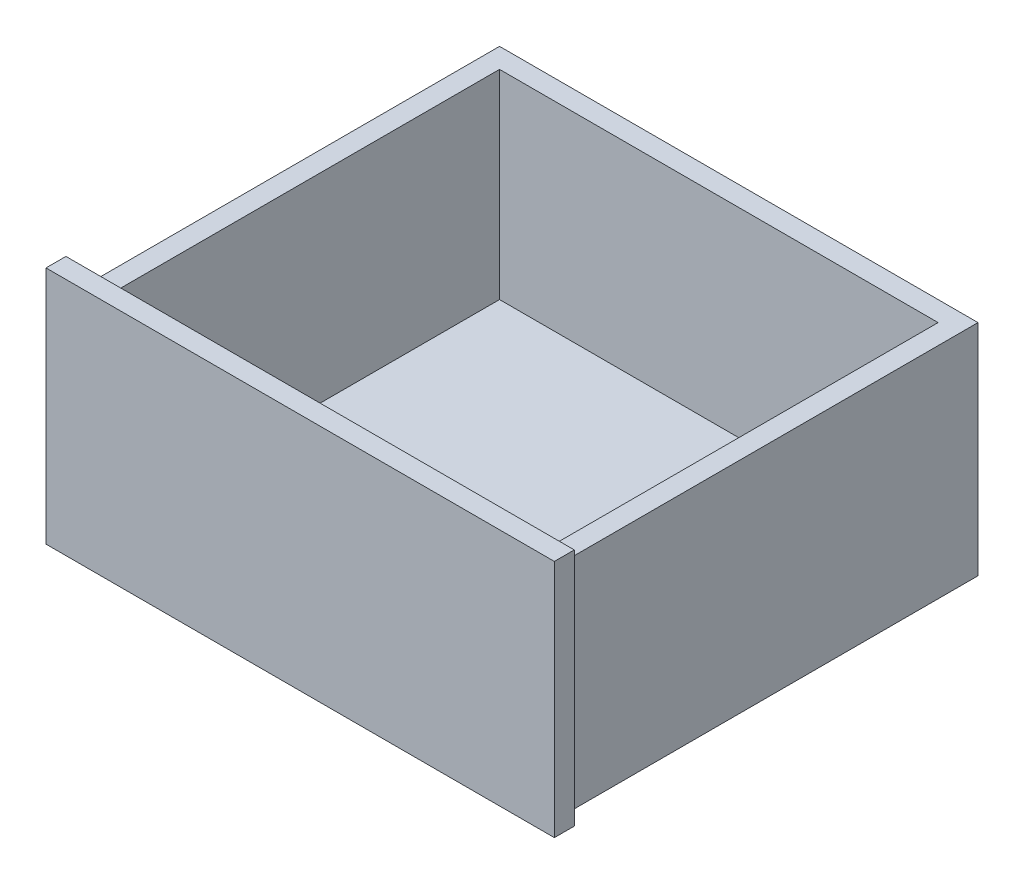
ISO-10303-21;
HEADER;
FILE_DESCRIPTION(('STEP AP214'),'2;1');
FILE_NAME('part.step','',(''),(''),'','','');
FILE_SCHEMA(('AUTOMOTIVE_DESIGN { 1 0 10303 214 1 1 1 1 }'));
ENDSEC;
DATA;
#1=APPLICATION_CONTEXT('core data for automotive mechanical design processes');
#2=APPLICATION_PROTOCOL_DEFINITION('international standard','automotive_design',2000,#1);
#3=PRODUCT_CONTEXT('',#1,'mechanical');
#4=PRODUCT('Part','Part','',(#3));
#5=PRODUCT_RELATED_PRODUCT_CATEGORY('part','',(#4));
#6=PRODUCT_DEFINITION_FORMATION('','',#4);
#7=PRODUCT_DEFINITION_CONTEXT('part definition',#1,'design');
#8=PRODUCT_DEFINITION('design','',#6,#7);
#9=PRODUCT_DEFINITION_SHAPE('','',#8);
#10=(LENGTH_UNIT() NAMED_UNIT(*) SI_UNIT(.MILLI.,.METRE.));
#11=(NAMED_UNIT(*) PLANE_ANGLE_UNIT() SI_UNIT($,.RADIAN.));
#12=(NAMED_UNIT(*) SI_UNIT($,.STERADIAN.) SOLID_ANGLE_UNIT());
#13=UNCERTAINTY_MEASURE_WITH_UNIT(LENGTH_MEASURE(1.E-05),#10,'distance_accuracy_value','');
#14=(GEOMETRIC_REPRESENTATION_CONTEXT(3) GLOBAL_UNCERTAINTY_ASSIGNED_CONTEXT((#13)) GLOBAL_UNIT_ASSIGNED_CONTEXT((#10,
#11,#12)) REPRESENTATION_CONTEXT('',''));
#15=CARTESIAN_POINT('',(0.,0.,0.));
#16=DIRECTION('',(0.,0.,1.));
#17=DIRECTION('',(1.,0.,0.));
#18=AXIS2_PLACEMENT_3D('',#15,#16,#17);
#19=CARTESIAN_POINT('',(0.,0.,0.));
#20=DIRECTION('',(0.,0.,-1.));
#21=DIRECTION('',(-1.,0.,0.));
#22=AXIS2_PLACEMENT_3D('',#19,#20,#21);
#23=PLANE('',#22);
#24=DIRECTION('',(0.,-1.,0.));
#25=VECTOR('',#24,1.);
#26=CARTESIAN_POINT('',(-30.48,96.241711093038,0.));
#27=LINE('',#26,#25);
#28=CARTESIAN_POINT('',(-30.48,12.7,0.));
#29=VERTEX_POINT('',#28);
#30=CARTESIAN_POINT('',(-30.48,-15.24,0.));
#31=VERTEX_POINT('',#30);
#32=EDGE_CURVE('E64',#29,#31,#27,.T.);
#33=ORIENTED_EDGE('',*,*,#32,.T.);
#34=DIRECTION('',(1.,0.,0.));
#35=VECTOR('',#34,1.);
#36=CARTESIAN_POINT('',(-32.385,-15.24,0.));
#37=LINE('',#36,#35);
#38=CARTESIAN_POINT('',(-32.385,-15.24,0.));
#39=VERTEX_POINT('',#38);
#40=EDGE_CURVE('E153',#39,#31,#37,.T.);
#41=ORIENTED_EDGE('',*,*,#40,.F.);
#42=DIRECTION('',(0.,-1.,0.));
#43=VECTOR('',#42,1.);
#44=CARTESIAN_POINT('',(-32.385,-15.24,0.));
#45=LINE('',#44,#43);
#46=CARTESIAN_POINT('',(-32.385,15.24,0.));
#47=VERTEX_POINT('',#46);
#48=EDGE_CURVE('E215',#47,#39,#45,.T.);
#49=ORIENTED_EDGE('',*,*,#48,.F.);
#50=DIRECTION('',(-1.,0.,0.));
#51=VECTOR('',#50,1.);
#52=CARTESIAN_POINT('',(-32.385,15.24,0.));
#53=LINE('',#52,#51);
#54=CARTESIAN_POINT('',(32.385,15.24,0.));
#55=VERTEX_POINT('',#54);
#56=EDGE_CURVE('E213',#55,#47,#53,.T.);
#57=ORIENTED_EDGE('',*,*,#56,.F.);
#58=DIRECTION('',(0.,1.,0.));
#59=VECTOR('',#58,1.);
#60=CARTESIAN_POINT('',(32.385,-15.24,0.));
#61=LINE('',#60,#59);
#62=CARTESIAN_POINT('',(32.385,-15.24,0.));
#63=VERTEX_POINT('',#62);
#64=EDGE_CURVE('E177',#63,#55,#61,.T.);
#65=ORIENTED_EDGE('',*,*,#64,.F.);
#66=CARTESIAN_POINT('',(30.48,-15.24,0.));
#67=VERTEX_POINT('',#66);
#68=EDGE_CURVE('E217',#67,#63,#37,.T.);
#69=ORIENTED_EDGE('',*,*,#68,.F.);
#70=DIRECTION('',(0.,-1.,0.));
#71=VECTOR('',#70,1.);
#72=CARTESIAN_POINT('',(30.48,96.241711093038,0.));
#73=LINE('',#72,#71);
#74=CARTESIAN_POINT('',(30.48,12.7,0.));
#75=VERTEX_POINT('',#74);
#76=EDGE_CURVE('E196',#75,#67,#73,.T.);
#77=ORIENTED_EDGE('',*,*,#76,.F.);
#78=DIRECTION('',(-1.,0.,0.));
#79=VECTOR('',#78,1.);
#80=CARTESIAN_POINT('',(0.,12.7,0.));
#81=LINE('',#80,#79);
#82=CARTESIAN_POINT('',(27.94,12.7,0.));
#83=VERTEX_POINT('',#82);
#84=EDGE_CURVE('E172',#75,#83,#81,.T.);
#85=ORIENTED_EDGE('',*,*,#84,.T.);
#86=DIRECTION('',(0.,-1.,0.));
#87=VECTOR('',#86,1.);
#88=CARTESIAN_POINT('',(27.94,96.241711093038,0.));
#89=LINE('',#88,#87);
#90=CARTESIAN_POINT('',(27.94,-12.7,0.));
#91=VERTEX_POINT('',#90);
#92=EDGE_CURVE('E56',#83,#91,#89,.T.);
#93=ORIENTED_EDGE('',*,*,#92,.T.);
#94=DIRECTION('',(-1.,0.,0.));
#95=VECTOR('',#94,1.);
#96=CARTESIAN_POINT('',(-30.48,-12.7,0.));
#97=LINE('',#96,#95);
#98=CARTESIAN_POINT('',(-27.94,-12.7,0.));
#99=VERTEX_POINT('',#98);
#100=EDGE_CURVE('E156',#91,#99,#97,.T.);
#101=ORIENTED_EDGE('',*,*,#100,.T.);
#102=DIRECTION('',(0.,-1.,0.));
#103=VECTOR('',#102,1.);
#104=CARTESIAN_POINT('',(-27.94,96.241711093038,0.));
#105=LINE('',#104,#103);
#106=CARTESIAN_POINT('',(-27.94,12.7,0.));
#107=VERTEX_POINT('',#106);
#108=EDGE_CURVE('E191',#107,#99,#105,.T.);
#109=ORIENTED_EDGE('',*,*,#108,.F.);
#110=DIRECTION('',(-1.,0.,0.));
#111=VECTOR('',#110,1.);
#112=CARTESIAN_POINT('',(0.,12.7,0.));
#113=LINE('',#112,#111);
#114=EDGE_CURVE('E162',#107,#29,#113,.T.);
#115=ORIENTED_EDGE('',*,*,#114,.T.);
#116=EDGE_LOOP('',(#33,#41,#49,#57,#65,#69,#77,#85,#93,#101,#109,#115));
#117=FACE_BOUND('',#116,.T.);
#118=ADVANCED_FACE('F41',(#117),#23,.T.);
#119=CARTESIAN_POINT('',(32.385,-15.24,2.54));
#120=DIRECTION('',(-1.,0.,0.));
#121=DIRECTION('',(0.,0.,1.));
#122=AXIS2_PLACEMENT_3D('',#119,#120,#121);
#123=PLANE('',#122);
#124=ORIENTED_EDGE('',*,*,#64,.T.);
#125=DIRECTION('',(0.,0.,-1.));
#126=VECTOR('',#125,1.);
#127=CARTESIAN_POINT('',(32.385,15.24,2.54));
#128=LINE('',#127,#126);
#129=CARTESIAN_POINT('',(32.385,15.24,2.54));
#130=VERTEX_POINT('',#129);
#131=EDGE_CURVE('E12',#130,#55,#128,.T.);
#132=ORIENTED_EDGE('',*,*,#131,.F.);
#133=DIRECTION('',(0.,1.,0.));
#134=VECTOR('',#133,1.);
#135=CARTESIAN_POINT('',(32.385,-15.24,2.54));
#136=LINE('',#135,#134);
#137=CARTESIAN_POINT('',(32.385,-15.24,2.54));
#138=VERTEX_POINT('',#137);
#139=EDGE_CURVE('E201',#138,#130,#136,.T.);
#140=ORIENTED_EDGE('',*,*,#139,.F.);
#141=DIRECTION('',(0.,0.,-1.));
#142=VECTOR('',#141,1.);
#143=CARTESIAN_POINT('',(32.385,-15.24,2.54));
#144=LINE('',#143,#142);
#145=EDGE_CURVE('E210',#138,#63,#144,.T.);
#146=ORIENTED_EDGE('',*,*,#145,.T.);
#147=EDGE_LOOP('',(#124,#132,#140,#146));
#148=FACE_BOUND('',#147,.T.);
#149=ADVANCED_FACE('F43',(#148),#123,.F.);
#150=CARTESIAN_POINT('',(-32.385,15.24,2.54));
#151=DIRECTION('',(0.,-1.,0.));
#152=DIRECTION('',(0.,0.,-1.));
#153=AXIS2_PLACEMENT_3D('',#150,#151,#152);
#154=PLANE('',#153);
#155=ORIENTED_EDGE('',*,*,#56,.T.);
#156=DIRECTION('',(0.,0.,-1.));
#157=VECTOR('',#156,1.);
#158=CARTESIAN_POINT('',(-32.385,15.24,2.54));
#159=LINE('',#158,#157);
#160=CARTESIAN_POINT('',(-32.385,15.24,2.54));
#161=VERTEX_POINT('',#160);
#162=EDGE_CURVE('E49',#161,#47,#159,.T.);
#163=ORIENTED_EDGE('',*,*,#162,.F.);
#164=DIRECTION('',(-1.,0.,0.));
#165=VECTOR('',#164,1.);
#166=CARTESIAN_POINT('',(-32.385,15.24,2.54));
#167=LINE('',#166,#165);
#168=EDGE_CURVE('E204',#130,#161,#167,.T.);
#169=ORIENTED_EDGE('',*,*,#168,.F.);
#170=ORIENTED_EDGE('',*,*,#131,.T.);
#171=EDGE_LOOP('',(#155,#163,#169,#170));
#172=FACE_BOUND('',#171,.T.);
#173=ADVANCED_FACE('F258',(#172),#154,.F.);
#174=CARTESIAN_POINT('',(-32.385,-15.24,2.54));
#175=DIRECTION('',(1.,0.,0.));
#176=DIRECTION('',(0.,0.,-1.));
#177=AXIS2_PLACEMENT_3D('',#174,#175,#176);
#178=PLANE('',#177);
#179=ORIENTED_EDGE('',*,*,#48,.T.);
#180=DIRECTION('',(0.,0.,-1.));
#181=VECTOR('',#180,1.);
#182=CARTESIAN_POINT('',(-32.385,-15.24,2.54));
#183=LINE('',#182,#181);
#184=CARTESIAN_POINT('',(-32.385,-15.24,2.54));
#185=VERTEX_POINT('',#184);
#186=EDGE_CURVE('E221',#185,#39,#183,.T.);
#187=ORIENTED_EDGE('',*,*,#186,.F.);
#188=DIRECTION('',(0.,-1.,0.));
#189=VECTOR('',#188,1.);
#190=CARTESIAN_POINT('',(-32.385,-15.24,2.54));
#191=LINE('',#190,#189);
#192=EDGE_CURVE('E206',#161,#185,#191,.T.);
#193=ORIENTED_EDGE('',*,*,#192,.F.);
#194=ORIENTED_EDGE('',*,*,#162,.T.);
#195=EDGE_LOOP('',(#179,#187,#193,#194));
#196=FACE_BOUND('',#195,.T.);
#197=ADVANCED_FACE('F227',(#196),#178,.F.);
#198=CARTESIAN_POINT('',(-32.385,-15.24,2.54));
#199=DIRECTION('',(0.,1.,0.));
#200=DIRECTION('',(0.,0.,1.));
#201=AXIS2_PLACEMENT_3D('',#198,#199,#200);
#202=PLANE('',#201);
#203=ORIENTED_EDGE('',*,*,#40,.T.);
#204=DIRECTION('',(0.,0.,-1.));
#205=VECTOR('',#204,1.);
#206=CARTESIAN_POINT('',(-30.48,-15.24,0.));
#207=LINE('',#206,#205);
#208=CARTESIAN_POINT('',(-30.48,-15.24,-53.34));
#209=VERTEX_POINT('',#208);
#210=EDGE_CURVE('E134',#31,#209,#207,.T.);
#211=ORIENTED_EDGE('',*,*,#210,.T.);
#212=DIRECTION('',(1.,0.,0.));
#213=VECTOR('',#212,1.);
#214=CARTESIAN_POINT('',(-30.48,-15.24,-53.34));
#215=LINE('',#214,#213);
#216=CARTESIAN_POINT('',(30.48,-15.24,-53.34));
#217=VERTEX_POINT('',#216);
#218=EDGE_CURVE('E142',#209,#217,#215,.T.);
#219=ORIENTED_EDGE('',*,*,#218,.T.);
#220=DIRECTION('',(0.,0.,1.));
#221=VECTOR('',#220,1.);
#222=CARTESIAN_POINT('',(30.48,-15.24,0.));
#223=LINE('',#222,#221);
#224=EDGE_CURVE('E148',#217,#67,#223,.T.);
#225=ORIENTED_EDGE('',*,*,#224,.T.);
#226=ORIENTED_EDGE('',*,*,#68,.T.);
#227=ORIENTED_EDGE('',*,*,#145,.F.);
#228=DIRECTION('',(1.,0.,0.));
#229=VECTOR('',#228,1.);
#230=CARTESIAN_POINT('',(-32.385,-15.24,2.54));
#231=LINE('',#230,#229);
#232=EDGE_CURVE('E208',#185,#138,#231,.T.);
#233=ORIENTED_EDGE('',*,*,#232,.F.);
#234=ORIENTED_EDGE('',*,*,#186,.T.);
#235=EDGE_LOOP('',(#203,#211,#219,#225,#226,#227,#233,#234));
#236=FACE_BOUND('',#235,.T.);
#237=ADVANCED_FACE('F150',(#236),#202,.F.);
#238=CARTESIAN_POINT('',(0.,0.,2.54));
#239=DIRECTION('',(0.,0.,-1.));
#240=DIRECTION('',(-1.,0.,0.));
#241=AXIS2_PLACEMENT_3D('',#238,#239,#240);
#242=PLANE('',#241);
#243=ORIENTED_EDGE('',*,*,#139,.T.);
#244=ORIENTED_EDGE('',*,*,#168,.T.);
#245=ORIENTED_EDGE('',*,*,#192,.T.);
#246=ORIENTED_EDGE('',*,*,#232,.T.);
#247=EDGE_LOOP('',(#243,#244,#245,#246));
#248=FACE_BOUND('',#247,.T.);
#249=ADVANCED_FACE('F257',(#248),#242,.F.);
#250=CARTESIAN_POINT('',(0.,96.241711093038,-50.8));
#251=DIRECTION('',(0.,0.,-1.));
#252=DIRECTION('',(-1.,0.,0.));
#253=AXIS2_PLACEMENT_3D('',#250,#251,#252);
#254=PLANE('',#253);
#255=DIRECTION('',(0.,-1.,0.));
#256=VECTOR('',#255,1.);
#257=CARTESIAN_POINT('',(27.94,96.241711093038,-50.8));
#258=LINE('',#257,#256);
#259=CARTESIAN_POINT('',(27.94,12.7,-50.8));
#260=VERTEX_POINT('',#259);
#261=CARTESIAN_POINT('',(27.94,-12.7,-50.8));
#262=VERTEX_POINT('',#261);
#263=EDGE_CURVE('E186',#260,#262,#258,.T.);
#264=ORIENTED_EDGE('',*,*,#263,.F.);
#265=DIRECTION('',(-1.,0.,0.));
#266=VECTOR('',#265,1.);
#267=CARTESIAN_POINT('',(0.,12.7,-50.8));
#268=LINE('',#267,#266);
#269=CARTESIAN_POINT('',(-27.94,12.7,-50.8));
#270=VERTEX_POINT('',#269);
#271=EDGE_CURVE('E163',#260,#270,#268,.T.);
#272=ORIENTED_EDGE('',*,*,#271,.T.);
#273=DIRECTION('',(0.,-1.,0.));
#274=VECTOR('',#273,1.);
#275=CARTESIAN_POINT('',(-27.94,96.241711093038,-50.8));
#276=LINE('',#275,#274);
#277=CARTESIAN_POINT('',(-27.94,-12.7,-50.8));
#278=VERTEX_POINT('',#277);
#279=EDGE_CURVE('E189',#270,#278,#276,.T.);
#280=ORIENTED_EDGE('',*,*,#279,.T.);
#281=DIRECTION('',(1.,0.,0.));
#282=VECTOR('',#281,1.);
#283=CARTESIAN_POINT('',(0.,-12.7,-50.8));
#284=LINE('',#283,#282);
#285=EDGE_CURVE('E184',#278,#262,#284,.T.);
#286=ORIENTED_EDGE('',*,*,#285,.T.);
#287=EDGE_LOOP('',(#264,#272,#280,#286));
#288=FACE_BOUND('',#287,.T.);
#289=ADVANCED_FACE('F242',(#288),#254,.F.);
#290=CARTESIAN_POINT('',(-27.94,96.241711093038,0.));
#291=DIRECTION('',(-1.,0.,0.));
#292=DIRECTION('',(0.,0.,1.));
#293=AXIS2_PLACEMENT_3D('',#290,#291,#292);
#294=PLANE('',#293);
#295=ORIENTED_EDGE('',*,*,#279,.F.);
#296=DIRECTION('',(0.,0.,1.));
#297=VECTOR('',#296,1.);
#298=CARTESIAN_POINT('',(-27.94,12.7,0.));
#299=LINE('',#298,#297);
#300=EDGE_CURVE('E159',#270,#107,#299,.T.);
#301=ORIENTED_EDGE('',*,*,#300,.T.);
#302=ORIENTED_EDGE('',*,*,#108,.T.);
#303=DIRECTION('',(0.,0.,-1.));
#304=VECTOR('',#303,1.);
#305=CARTESIAN_POINT('',(-27.94,-12.7,0.));
#306=LINE('',#305,#304);
#307=EDGE_CURVE('E181',#99,#278,#306,.T.);
#308=ORIENTED_EDGE('',*,*,#307,.T.);
#309=EDGE_LOOP('',(#295,#301,#302,#308));
#310=FACE_BOUND('',#309,.T.);
#311=ADVANCED_FACE('F237',(#310),#294,.F.);
#312=CARTESIAN_POINT('',(-30.48,96.241711093038,0.));
#313=DIRECTION('',(1.,0.,0.));
#314=DIRECTION('',(0.,0.,-1.));
#315=AXIS2_PLACEMENT_3D('',#312,#313,#314);
#316=PLANE('',#315);
#317=ORIENTED_EDGE('',*,*,#32,.F.);
#318=DIRECTION('',(0.,0.,-1.));
#319=VECTOR('',#318,1.);
#320=CARTESIAN_POINT('',(-30.48,12.7,0.));
#321=LINE('',#320,#319);
#322=CARTESIAN_POINT('',(-30.48,12.7,-53.34));
#323=VERTEX_POINT('',#322);
#324=EDGE_CURVE('E136',#29,#323,#321,.T.);
#325=ORIENTED_EDGE('',*,*,#324,.T.);
#326=DIRECTION('',(0.,-1.,0.));
#327=VECTOR('',#326,1.);
#328=CARTESIAN_POINT('',(-30.48,96.241711093038,-53.34));
#329=LINE('',#328,#327);
#330=EDGE_CURVE('E130',#323,#209,#329,.T.);
#331=ORIENTED_EDGE('',*,*,#330,.T.);
#332=ORIENTED_EDGE('',*,*,#210,.F.);
#333=EDGE_LOOP('',(#317,#325,#331,#332));
#334=FACE_BOUND('',#333,.T.);
#335=ADVANCED_FACE('F132',(#334),#316,.F.);
#336=CARTESIAN_POINT('',(0.,96.241711093038,-53.34));
#337=DIRECTION('',(0.,0.,1.));
#338=DIRECTION('',(1.,0.,0.));
#339=AXIS2_PLACEMENT_3D('',#336,#337,#338);
#340=PLANE('',#339);
#341=ORIENTED_EDGE('',*,*,#330,.F.);
#342=DIRECTION('',(1.,0.,0.));
#343=VECTOR('',#342,1.);
#344=CARTESIAN_POINT('',(0.,12.7,-53.34));
#345=LINE('',#344,#343);
#346=CARTESIAN_POINT('',(30.48,12.7,-53.34));
#347=VERTEX_POINT('',#346);
#348=EDGE_CURVE('E167',#323,#347,#345,.T.);
#349=ORIENTED_EDGE('',*,*,#348,.T.);
#350=DIRECTION('',(0.,-1.,0.));
#351=VECTOR('',#350,1.);
#352=CARTESIAN_POINT('',(30.48,96.241711093038,-53.34));
#353=LINE('',#352,#351);
#354=EDGE_CURVE('E139',#347,#217,#353,.T.);
#355=ORIENTED_EDGE('',*,*,#354,.T.);
#356=ORIENTED_EDGE('',*,*,#218,.F.);
#357=EDGE_LOOP('',(#341,#349,#355,#356));
#358=FACE_BOUND('',#357,.T.);
#359=ADVANCED_FACE('F143',(#358),#340,.F.);
#360=CARTESIAN_POINT('',(30.48,96.241711093038,0.));
#361=DIRECTION('',(-1.,0.,0.));
#362=DIRECTION('',(0.,0.,1.));
#363=AXIS2_PLACEMENT_3D('',#360,#361,#362);
#364=PLANE('',#363);
#365=ORIENTED_EDGE('',*,*,#354,.F.);
#366=DIRECTION('',(0.,0.,1.));
#367=VECTOR('',#366,1.);
#368=CARTESIAN_POINT('',(30.48,12.7,0.));
#369=LINE('',#368,#367);
#370=EDGE_CURVE('E169',#347,#75,#369,.T.);
#371=ORIENTED_EDGE('',*,*,#370,.T.);
#372=ORIENTED_EDGE('',*,*,#76,.T.);
#373=ORIENTED_EDGE('',*,*,#224,.F.);
#374=EDGE_LOOP('',(#365,#371,#372,#373));
#375=FACE_BOUND('',#374,.T.);
#376=ADVANCED_FACE('F250',(#375),#364,.F.);
#377=CARTESIAN_POINT('',(27.94,96.241711093038,0.));
#378=DIRECTION('',(-1.,0.,0.));
#379=DIRECTION('',(0.,0.,1.));
#380=AXIS2_PLACEMENT_3D('',#377,#378,#379);
#381=PLANE('',#380);
#382=DIRECTION('',(0.,0.,1.));
#383=VECTOR('',#382,1.);
#384=CARTESIAN_POINT('',(27.94,12.7,0.));
#385=LINE('',#384,#383);
#386=EDGE_CURVE('E175',#260,#83,#385,.T.);
#387=ORIENTED_EDGE('',*,*,#386,.F.);
#388=ORIENTED_EDGE('',*,*,#263,.T.);
#389=DIRECTION('',(0.,0.,-1.));
#390=VECTOR('',#389,1.);
#391=CARTESIAN_POINT('',(27.94,-12.7,0.));
#392=LINE('',#391,#390);
#393=EDGE_CURVE('E178',#91,#262,#392,.T.);
#394=ORIENTED_EDGE('',*,*,#393,.F.);
#395=ORIENTED_EDGE('',*,*,#92,.F.);
#396=EDGE_LOOP('',(#387,#388,#394,#395));
#397=FACE_BOUND('',#396,.T.);
#398=ADVANCED_FACE('F243',(#397),#381,.T.);
#399=CARTESIAN_POINT('',(-32.385,12.7,2.54));
#400=DIRECTION('',(0.,-1.,0.));
#401=DIRECTION('',(0.,0.,-1.));
#402=AXIS2_PLACEMENT_3D('',#399,#400,#401);
#403=PLANE('',#402);
#404=ORIENTED_EDGE('',*,*,#386,.T.);
#405=ORIENTED_EDGE('',*,*,#84,.F.);
#406=ORIENTED_EDGE('',*,*,#370,.F.);
#407=ORIENTED_EDGE('',*,*,#348,.F.);
#408=ORIENTED_EDGE('',*,*,#324,.F.);
#409=ORIENTED_EDGE('',*,*,#114,.F.);
#410=ORIENTED_EDGE('',*,*,#300,.F.);
#411=ORIENTED_EDGE('',*,*,#271,.F.);
#412=EDGE_LOOP('',(#404,#405,#406,#407,#408,#409,#410,#411));
#413=FACE_BOUND('',#412,.T.);
#414=ADVANCED_FACE('F234',(#413),#403,.F.);
#415=CARTESIAN_POINT('',(0.,-12.7,0.));
#416=DIRECTION('',(0.,-1.,0.));
#417=DIRECTION('',(0.,0.,-1.));
#418=AXIS2_PLACEMENT_3D('',#415,#416,#417);
#419=PLANE('',#418);
#420=ORIENTED_EDGE('',*,*,#285,.F.);
#421=ORIENTED_EDGE('',*,*,#307,.F.);
#422=ORIENTED_EDGE('',*,*,#100,.F.);
#423=ORIENTED_EDGE('',*,*,#393,.T.);
#424=EDGE_LOOP('',(#420,#421,#422,#423));
#425=FACE_BOUND('',#424,.T.);
#426=ADVANCED_FACE('F246',(#425),#419,.F.);
#427=CLOSED_SHELL('',(#118,#149,#173,#197,#237,#249,#289,#311,#335,#359,#376,#398,#414,#426));
#428=MANIFOLD_SOLID_BREP('B2',#427);
#429=ADVANCED_BREP_SHAPE_REPRESENTATION('',(#18,#428),#14);
#430=SHAPE_DEFINITION_REPRESENTATION(#9,#429);
ENDSEC;
END-ISO-10303-21;
